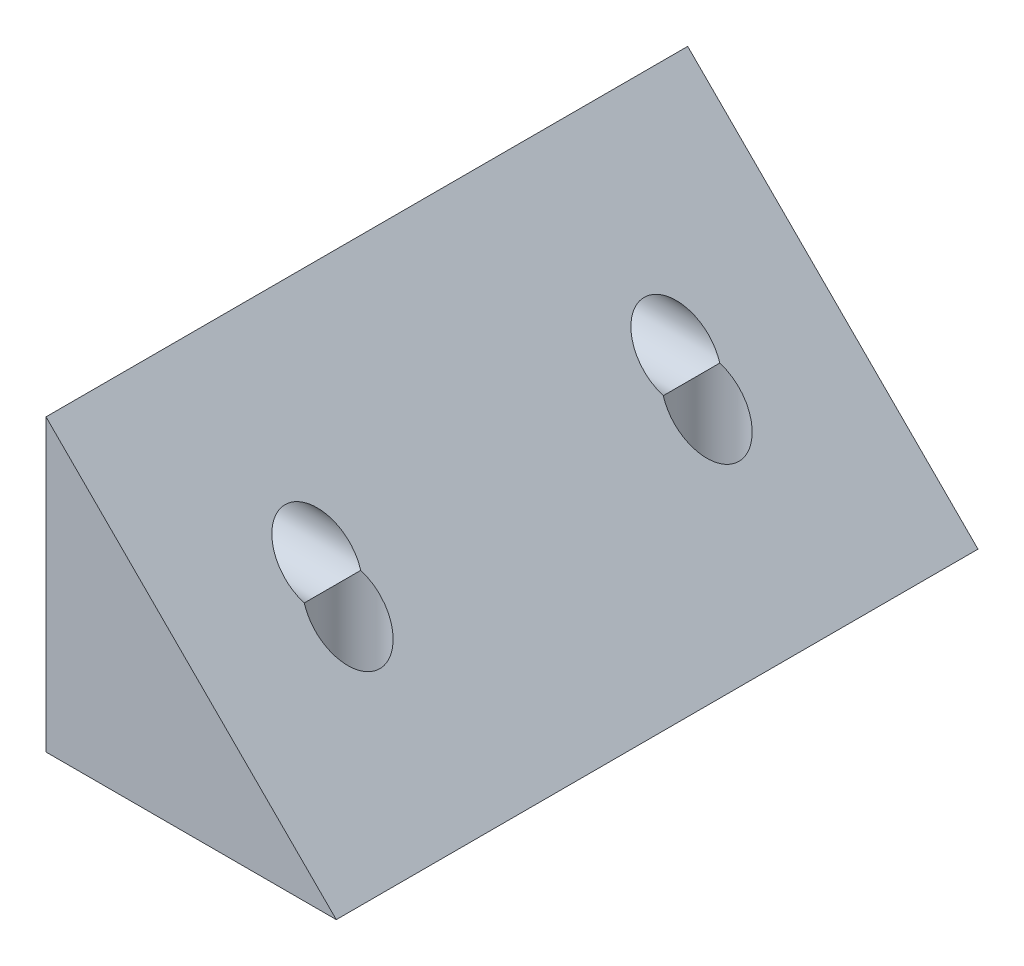
ISO-10303-21;
HEADER;
FILE_DESCRIPTION(('STEP AP214'),'2;1');
FILE_NAME('part.step','',(''),(''),'','','');
FILE_SCHEMA(('AUTOMOTIVE_DESIGN { 1 0 10303 214 1 1 1 1 }'));
ENDSEC;
DATA;
#1=APPLICATION_CONTEXT('core data for automotive mechanical design processes');
#2=APPLICATION_PROTOCOL_DEFINITION('international standard','automotive_design',2000,#1);
#3=PRODUCT_CONTEXT('',#1,'mechanical');
#4=PRODUCT('Part','Part','',(#3));
#5=PRODUCT_RELATED_PRODUCT_CATEGORY('part','',(#4));
#6=PRODUCT_DEFINITION_FORMATION('','',#4);
#7=PRODUCT_DEFINITION_CONTEXT('part definition',#1,'design');
#8=PRODUCT_DEFINITION('design','',#6,#7);
#9=PRODUCT_DEFINITION_SHAPE('','',#8);
#10=(LENGTH_UNIT() NAMED_UNIT(*) SI_UNIT(.MILLI.,.METRE.));
#11=(NAMED_UNIT(*) PLANE_ANGLE_UNIT() SI_UNIT($,.RADIAN.));
#12=(NAMED_UNIT(*) SI_UNIT($,.STERADIAN.) SOLID_ANGLE_UNIT());
#13=UNCERTAINTY_MEASURE_WITH_UNIT(LENGTH_MEASURE(1.E-05),#10,'distance_accuracy_value','');
#14=(GEOMETRIC_REPRESENTATION_CONTEXT(3) GLOBAL_UNCERTAINTY_ASSIGNED_CONTEXT((#13)) GLOBAL_UNIT_ASSIGNED_CONTEXT((#10,
#11,#12)) REPRESENTATION_CONTEXT('',''));
#15=CARTESIAN_POINT('',(0.,0.,0.));
#16=DIRECTION('',(0.,0.,1.));
#17=DIRECTION('',(1.,0.,0.));
#18=AXIS2_PLACEMENT_3D('',#15,#16,#17);
#19=CARTESIAN_POINT('',(0.,0.,42.));
#20=DIRECTION('',(1.,0.,0.));
#21=DIRECTION('',(0.,0.,-1.));
#22=AXIS2_PLACEMENT_3D('',#19,#20,#21);
#23=PLANE('',#22);
#24=CARTESIAN_POINT('',(0.,10.5,9.25000000000002));
#25=DIRECTION('',(-1.,0.,0.));
#26=DIRECTION('',(0.,0.,-1.));
#27=AXIS2_PLACEMENT_3D('',#24,#25,#26);
#28=CIRCLE('',#27,2.1);
#29=CARTESIAN_POINT('',(0.,10.5,7.15000000000002));
#30=VERTEX_POINT('',#29);
#31=EDGE_CURVE('E86',#30,#30,#28,.T.);
#32=ORIENTED_EDGE('',*,*,#31,.F.);
#33=EDGE_LOOP('',(#32));
#34=FACE_BOUND('',#33,.T.);
#35=CARTESIAN_POINT('',(0.,10.5,32.75));
#36=DIRECTION('',(-1.,0.,0.));
#37=DIRECTION('',(0.,0.,1.));
#38=AXIS2_PLACEMENT_3D('',#35,#36,#37);
#39=CIRCLE('',#38,2.1);
#40=CARTESIAN_POINT('',(0.,10.5,34.85));
#41=VERTEX_POINT('',#40);
#42=EDGE_CURVE('E85',#41,#41,#39,.T.);
#43=ORIENTED_EDGE('',*,*,#42,.F.);
#44=EDGE_LOOP('',(#43));
#45=FACE_BOUND('',#44,.T.);
#46=DIRECTION('',(0.,-1.,0.));
#47=VECTOR('',#46,1.);
#48=CARTESIAN_POINT('',(0.,0.,0.));
#49=LINE('',#48,#47);
#50=CARTESIAN_POINT('',(0.,19.,0.));
#51=VERTEX_POINT('',#50);
#52=CARTESIAN_POINT('',(0.,0.,0.));
#53=VERTEX_POINT('',#52);
#54=EDGE_CURVE('E120',#51,#53,#49,.T.);
#55=ORIENTED_EDGE('',*,*,#54,.T.);
#56=DIRECTION('',(0.,0.,-1.));
#57=VECTOR('',#56,1.);
#58=CARTESIAN_POINT('',(0.,0.,42.));
#59=LINE('',#58,#57);
#60=CARTESIAN_POINT('',(0.,0.,42.));
#61=VERTEX_POINT('',#60);
#62=EDGE_CURVE('E99',#61,#53,#59,.T.);
#63=ORIENTED_EDGE('',*,*,#62,.F.);
#64=DIRECTION('',(0.,-1.,0.));
#65=VECTOR('',#64,1.);
#66=CARTESIAN_POINT('',(0.,0.,42.));
#67=LINE('',#66,#65);
#68=CARTESIAN_POINT('',(0.,19.,42.));
#69=VERTEX_POINT('',#68);
#70=EDGE_CURVE('E117',#69,#61,#67,.T.);
#71=ORIENTED_EDGE('',*,*,#70,.F.);
#72=DIRECTION('',(0.,0.,-1.));
#73=VECTOR('',#72,1.);
#74=CARTESIAN_POINT('',(0.,19.,42.));
#75=LINE('',#74,#73);
#76=EDGE_CURVE('E109',#69,#51,#75,.T.);
#77=ORIENTED_EDGE('',*,*,#76,.T.);
#78=EDGE_LOOP('',(#55,#63,#71,#77));
#79=FACE_BOUND('',#78,.T.);
#80=ADVANCED_FACE('F35',(#34,#45,#79),#23,.F.);
#81=CARTESIAN_POINT('',(19.,0.,42.));
#82=DIRECTION('',(0.,1.,0.));
#83=DIRECTION('',(0.,0.,1.));
#84=AXIS2_PLACEMENT_3D('',#81,#82,#83);
#85=PLANE('',#84);
#86=CARTESIAN_POINT('',(10.5,0.,9.25000000000002));
#87=DIRECTION('',(0.,-1.,0.));
#88=DIRECTION('',(0.,0.,1.));
#89=AXIS2_PLACEMENT_3D('',#86,#87,#88);
#90=CIRCLE('',#89,2.1);
#91=CARTESIAN_POINT('',(10.5,0.,11.35));
#92=VERTEX_POINT('',#91);
#93=EDGE_CURVE('E90',#92,#92,#90,.T.);
#94=ORIENTED_EDGE('',*,*,#93,.F.);
#95=EDGE_LOOP('',(#94));
#96=FACE_BOUND('',#95,.T.);
#97=CARTESIAN_POINT('',(10.5,0.,32.75));
#98=DIRECTION('',(0.,-1.,0.));
#99=DIRECTION('',(0.,0.,-1.));
#100=AXIS2_PLACEMENT_3D('',#97,#98,#99);
#101=CIRCLE('',#100,2.1);
#102=CARTESIAN_POINT('',(10.5,0.,30.65));
#103=VERTEX_POINT('',#102);
#104=EDGE_CURVE('E89',#103,#103,#101,.T.);
#105=ORIENTED_EDGE('',*,*,#104,.F.);
#106=EDGE_LOOP('',(#105));
#107=FACE_BOUND('',#106,.T.);
#108=DIRECTION('',(1.,0.,0.));
#109=VECTOR('',#108,1.);
#110=CARTESIAN_POINT('',(19.,0.,0.));
#111=LINE('',#110,#109);
#112=CARTESIAN_POINT('',(19.,0.,0.));
#113=VERTEX_POINT('',#112);
#114=EDGE_CURVE('E118',#53,#113,#111,.T.);
#115=ORIENTED_EDGE('',*,*,#114,.T.);
#116=DIRECTION('',(0.,0.,-1.));
#117=VECTOR('',#116,1.);
#118=CARTESIAN_POINT('',(19.,0.,42.));
#119=LINE('',#118,#117);
#120=CARTESIAN_POINT('',(19.,0.,42.));
#121=VERTEX_POINT('',#120);
#122=EDGE_CURVE('E104',#121,#113,#119,.T.);
#123=ORIENTED_EDGE('',*,*,#122,.F.);
#124=DIRECTION('',(1.,0.,0.));
#125=VECTOR('',#124,1.);
#126=CARTESIAN_POINT('',(19.,0.,42.));
#127=LINE('',#126,#125);
#128=EDGE_CURVE('E123',#61,#121,#127,.T.);
#129=ORIENTED_EDGE('',*,*,#128,.F.);
#130=ORIENTED_EDGE('',*,*,#62,.T.);
#131=EDGE_LOOP('',(#115,#123,#129,#130));
#132=FACE_BOUND('',#131,.T.);
#133=ADVANCED_FACE('F136',(#96,#107,#132),#85,.F.);
#134=CARTESIAN_POINT('',(0.,19.,42.));
#135=DIRECTION('',(-0.707106781186547,-0.707106781186547,0.));
#136=DIRECTION('',(0.707106781186548,-0.707106781186548,0.));
#137=AXIS2_PLACEMENT_3D('',#134,#135,#136);
#138=PLANE('',#137);
#139=CARTESIAN_POINT('',(10.5,8.5,9.25000000000002));
#140=DIRECTION('',(-0.707106781186547,-0.707106781186547,0.));
#141=DIRECTION('',(0.707106781186548,-0.707106781186548,0.));
#142=AXIS2_PLACEMENT_3D('',#139,#140,#141);
#143=ELLIPSE('',#142,2.9698484809835,2.1);
#144=CARTESIAN_POINT('',(9.5,9.5,7.40338146873808));
#145=VERTEX_POINT('',#144);
#146=CARTESIAN_POINT('',(9.5,9.5,11.0966185312619));
#147=VERTEX_POINT('',#146);
#148=EDGE_CURVE('E84',#145,#147,#143,.T.);
#149=ORIENTED_EDGE('',*,*,#148,.T.);
#150=CARTESIAN_POINT('',(8.5,10.5,9.25000000000002));
#151=DIRECTION('',(-0.707106781186547,-0.707106781186547,0.));
#152=DIRECTION('',(-0.707106781186548,0.707106781186548,0.));
#153=AXIS2_PLACEMENT_3D('',#150,#151,#152);
#154=ELLIPSE('',#153,2.9698484809835,2.1);
#155=EDGE_CURVE('E48',#147,#145,#154,.T.);
#156=ORIENTED_EDGE('',*,*,#155,.T.);
#157=EDGE_LOOP('',(#149,#156));
#158=FACE_BOUND('',#157,.T.);
#159=CARTESIAN_POINT('',(10.5,8.5,32.75));
#160=DIRECTION('',(-0.707106781186547,-0.707106781186547,0.));
#161=DIRECTION('',(0.707106781186548,-0.707106781186548,0.));
#162=AXIS2_PLACEMENT_3D('',#159,#160,#161);
#163=ELLIPSE('',#162,2.9698484809835,2.1);
#164=CARTESIAN_POINT('',(9.5,9.5,30.9033814687381));
#165=VERTEX_POINT('',#164);
#166=CARTESIAN_POINT('',(9.5,9.5,34.5966185312619));
#167=VERTEX_POINT('',#166);
#168=EDGE_CURVE('E93',#165,#167,#163,.T.);
#169=ORIENTED_EDGE('',*,*,#168,.T.);
#170=CARTESIAN_POINT('',(8.5,10.5,32.75));
#171=DIRECTION('',(-0.707106781186547,-0.707106781186547,0.));
#172=DIRECTION('',(-0.707106781186548,0.707106781186548,0.));
#173=AXIS2_PLACEMENT_3D('',#170,#171,#172);
#174=ELLIPSE('',#173,2.9698484809835,2.1);
#175=EDGE_CURVE('E54',#167,#165,#174,.T.);
#176=ORIENTED_EDGE('',*,*,#175,.T.);
#177=EDGE_LOOP('',(#169,#176));
#178=FACE_BOUND('',#177,.T.);
#179=DIRECTION('',(-0.707106781186548,0.707106781186548,0.));
#180=VECTOR('',#179,1.);
#181=CARTESIAN_POINT('',(0.,19.,0.));
#182=LINE('',#181,#180);
#183=EDGE_CURVE('E115',#113,#51,#182,.T.);
#184=ORIENTED_EDGE('',*,*,#183,.T.);
#185=ORIENTED_EDGE('',*,*,#76,.F.);
#186=DIRECTION('',(-0.707106781186548,0.707106781186548,0.));
#187=VECTOR('',#186,1.);
#188=CARTESIAN_POINT('',(0.,19.,42.));
#189=LINE('',#188,#187);
#190=EDGE_CURVE('E114',#121,#69,#189,.T.);
#191=ORIENTED_EDGE('',*,*,#190,.F.);
#192=ORIENTED_EDGE('',*,*,#122,.T.);
#193=EDGE_LOOP('',(#184,#185,#191,#192));
#194=FACE_BOUND('',#193,.T.);
#195=ADVANCED_FACE('F82',(#158,#178,#194),#138,.F.);
#196=CARTESIAN_POINT('',(0.,0.,42.));
#197=DIRECTION('',(0.,0.,1.));
#198=DIRECTION('',(1.,0.,0.));
#199=AXIS2_PLACEMENT_3D('',#196,#197,#198);
#200=PLANE('',#199);
#201=ORIENTED_EDGE('',*,*,#70,.T.);
#202=ORIENTED_EDGE('',*,*,#128,.T.);
#203=ORIENTED_EDGE('',*,*,#190,.T.);
#204=EDGE_LOOP('',(#201,#202,#203));
#205=FACE_BOUND('',#204,.T.);
#206=ADVANCED_FACE('F149',(#205),#200,.T.);
#207=CARTESIAN_POINT('',(0.,0.,0.));
#208=DIRECTION('',(0.,0.,1.));
#209=DIRECTION('',(1.,0.,0.));
#210=AXIS2_PLACEMENT_3D('',#207,#208,#209);
#211=PLANE('',#210);
#212=ORIENTED_EDGE('',*,*,#54,.F.);
#213=ORIENTED_EDGE('',*,*,#183,.F.);
#214=ORIENTED_EDGE('',*,*,#114,.F.);
#215=EDGE_LOOP('',(#212,#213,#214));
#216=FACE_BOUND('',#215,.T.);
#217=ADVANCED_FACE('F144',(#216),#211,.F.);
#218=CARTESIAN_POINT('',(10.5,42.,32.75));
#219=DIRECTION('',(0.,-1.,0.));
#220=DIRECTION('',(0.,0.,-1.));
#221=AXIS2_PLACEMENT_3D('',#218,#219,#220);
#222=CYLINDRICAL_SURFACE('',#221,2.1);
#223=ORIENTED_EDGE('',*,*,#104,.T.);
#224=EDGE_LOOP('',(#223));
#225=FACE_BOUND('',#224,.T.);
#226=ORIENTED_EDGE('',*,*,#168,.F.);
#227=CARTESIAN_POINT('',(10.5,10.5,32.75));
#228=DIRECTION('',(0.707106781186547,-0.707106781186547,0.));
#229=DIRECTION('',(-0.707106781186547,-0.707106781186547,0.));
#230=AXIS2_PLACEMENT_3D('',#227,#228,#229);
#231=ELLIPSE('',#230,2.9698484809835,2.1);
#232=EDGE_CURVE('E42',#165,#167,#231,.F.);
#233=ORIENTED_EDGE('',*,*,#232,.T.);
#234=EDGE_LOOP('',(#226,#233));
#235=FACE_BOUND('',#234,.T.);
#236=ADVANCED_FACE('F156',(#225,#235),#222,.F.);
#237=CARTESIAN_POINT('',(10.5,42.,9.25000000000002));
#238=DIRECTION('',(0.,-1.,0.));
#239=DIRECTION('',(0.,0.,-1.));
#240=AXIS2_PLACEMENT_3D('',#237,#238,#239);
#241=CYLINDRICAL_SURFACE('',#240,2.1);
#242=ORIENTED_EDGE('',*,*,#93,.T.);
#243=EDGE_LOOP('',(#242));
#244=FACE_BOUND('',#243,.T.);
#245=ORIENTED_EDGE('',*,*,#148,.F.);
#246=CARTESIAN_POINT('',(10.5,10.5,9.25000000000002));
#247=DIRECTION('',(0.707106781186547,-0.707106781186547,0.));
#248=DIRECTION('',(-0.707106781186547,-0.707106781186547,0.));
#249=AXIS2_PLACEMENT_3D('',#246,#247,#248);
#250=ELLIPSE('',#249,2.9698484809835,2.1);
#251=EDGE_CURVE('E11',#145,#147,#250,.F.);
#252=ORIENTED_EDGE('',*,*,#251,.T.);
#253=EDGE_LOOP('',(#245,#252));
#254=FACE_BOUND('',#253,.T.);
#255=ADVANCED_FACE('F88',(#244,#254),#241,.F.);
#256=CARTESIAN_POINT('',(42.,10.5,32.75));
#257=DIRECTION('',(-1.,0.,0.));
#258=DIRECTION('',(0.,0.,1.));
#259=AXIS2_PLACEMENT_3D('',#256,#257,#258);
#260=CYLINDRICAL_SURFACE('',#259,2.1);
#261=ORIENTED_EDGE('',*,*,#42,.T.);
#262=EDGE_LOOP('',(#261));
#263=FACE_BOUND('',#262,.T.);
#264=ORIENTED_EDGE('',*,*,#232,.F.);
#265=ORIENTED_EDGE('',*,*,#175,.F.);
#266=EDGE_LOOP('',(#264,#265));
#267=FACE_BOUND('',#266,.T.);
#268=ADVANCED_FACE('F173',(#263,#267),#260,.F.);
#269=CARTESIAN_POINT('',(42.,10.5,9.25000000000002));
#270=DIRECTION('',(-1.,0.,0.));
#271=DIRECTION('',(0.,0.,1.));
#272=AXIS2_PLACEMENT_3D('',#269,#270,#271);
#273=CYLINDRICAL_SURFACE('',#272,2.1);
#274=ORIENTED_EDGE('',*,*,#31,.T.);
#275=EDGE_LOOP('',(#274));
#276=FACE_BOUND('',#275,.T.);
#277=ORIENTED_EDGE('',*,*,#251,.F.);
#278=ORIENTED_EDGE('',*,*,#155,.F.);
#279=EDGE_LOOP('',(#277,#278));
#280=FACE_BOUND('',#279,.T.);
#281=ADVANCED_FACE('F77',(#276,#280),#273,.F.);
#282=CLOSED_SHELL('',(#80,#133,#195,#206,#217,#236,#255,#268,#281));
#283=MANIFOLD_SOLID_BREP('B2',#282);
#284=ADVANCED_BREP_SHAPE_REPRESENTATION('',(#18,#283),#14);
#285=SHAPE_DEFINITION_REPRESENTATION(#9,#284);
ENDSEC;
END-ISO-10303-21;
